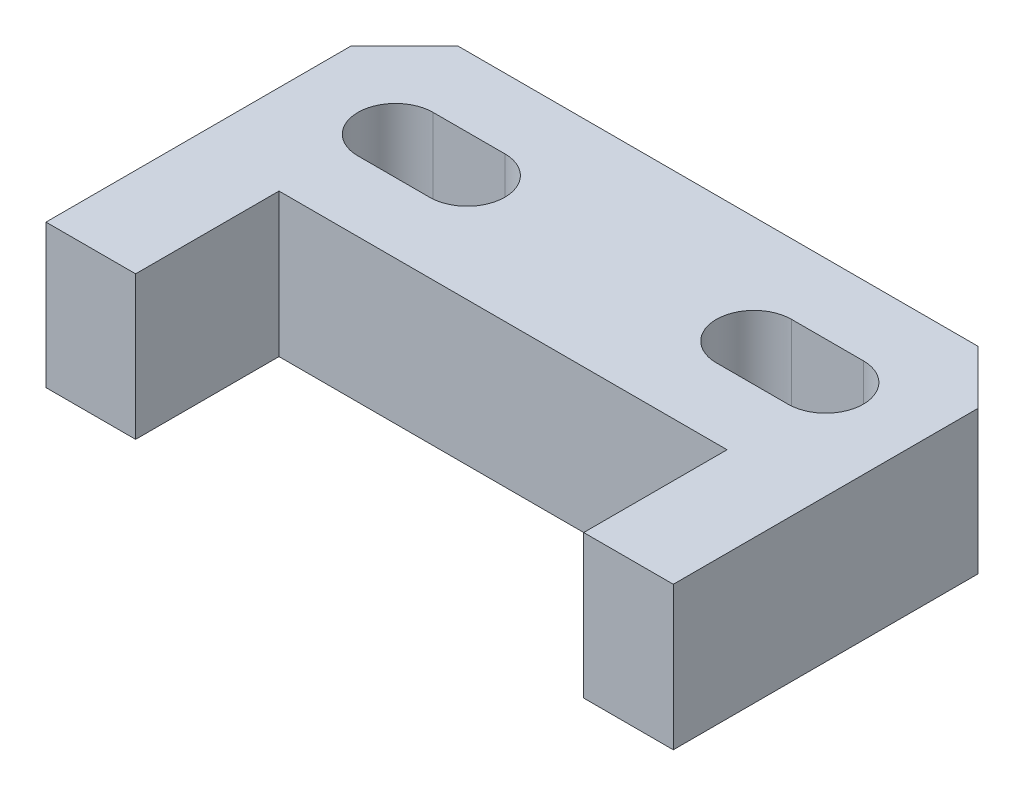
ISO-10303-21;
HEADER;
FILE_DESCRIPTION(('STEP AP214'),'2;1');
FILE_NAME('part.step','',(''),(''),'','','');
FILE_SCHEMA(('AUTOMOTIVE_DESIGN { 1 0 10303 214 1 1 1 1 }'));
ENDSEC;
DATA;
#1=APPLICATION_CONTEXT('core data for automotive mechanical design processes');
#2=APPLICATION_PROTOCOL_DEFINITION('international standard','automotive_design',2000,#1);
#3=PRODUCT_CONTEXT('',#1,'mechanical');
#4=PRODUCT('Part','Part','',(#3));
#5=PRODUCT_RELATED_PRODUCT_CATEGORY('part','',(#4));
#6=PRODUCT_DEFINITION_FORMATION('','',#4);
#7=PRODUCT_DEFINITION_CONTEXT('part definition',#1,'design');
#8=PRODUCT_DEFINITION('design','',#6,#7);
#9=PRODUCT_DEFINITION_SHAPE('','',#8);
#10=(LENGTH_UNIT() NAMED_UNIT(*) SI_UNIT(.MILLI.,.METRE.));
#11=(NAMED_UNIT(*) PLANE_ANGLE_UNIT() SI_UNIT($,.RADIAN.));
#12=(NAMED_UNIT(*) SI_UNIT($,.STERADIAN.) SOLID_ANGLE_UNIT());
#13=UNCERTAINTY_MEASURE_WITH_UNIT(LENGTH_MEASURE(1.E-05),#10,'distance_accuracy_value','');
#14=(GEOMETRIC_REPRESENTATION_CONTEXT(3) GLOBAL_UNCERTAINTY_ASSIGNED_CONTEXT((#13)) GLOBAL_UNIT_ASSIGNED_CONTEXT((#10,
#11,#12)) REPRESENTATION_CONTEXT('',''));
#15=CARTESIAN_POINT('',(0.,0.,0.));
#16=DIRECTION('',(0.,0.,1.));
#17=DIRECTION('',(1.,0.,0.));
#18=AXIS2_PLACEMENT_3D('',#15,#16,#17);
#19=CARTESIAN_POINT('',(5.,8.,0.));
#20=DIRECTION('',(0.,0.,-1.));
#21=DIRECTION('',(-1.,0.,0.));
#22=AXIS2_PLACEMENT_3D('',#19,#20,#21);
#23=PLANE('',#22);
#24=DIRECTION('',(1.,0.,0.));
#25=VECTOR('',#24,1.);
#26=CARTESIAN_POINT('',(5.,0.,0.));
#27=LINE('',#26,#25);
#28=CARTESIAN_POINT('',(0.,0.,0.));
#29=VERTEX_POINT('',#28);
#30=CARTESIAN_POINT('',(5.,0.,0.));
#31=VERTEX_POINT('',#30);
#32=EDGE_CURVE('E231',#29,#31,#27,.T.);
#33=ORIENTED_EDGE('',*,*,#32,.T.);
#34=DIRECTION('',(0.,-1.,0.));
#35=VECTOR('',#34,1.);
#36=CARTESIAN_POINT('',(5.,8.,0.));
#37=LINE('',#36,#35);
#38=CARTESIAN_POINT('',(5.,8.,0.));
#39=VERTEX_POINT('',#38);
#40=EDGE_CURVE('E287',#39,#31,#37,.T.);
#41=ORIENTED_EDGE('',*,*,#40,.F.);
#42=DIRECTION('',(1.,0.,0.));
#43=VECTOR('',#42,1.);
#44=CARTESIAN_POINT('',(5.,8.,0.));
#45=LINE('',#44,#43);
#46=CARTESIAN_POINT('',(0.,8.,0.));
#47=VERTEX_POINT('',#46);
#48=EDGE_CURVE('E238',#47,#39,#45,.T.);
#49=ORIENTED_EDGE('',*,*,#48,.F.);
#50=DIRECTION('',(0.,-1.,0.));
#51=VECTOR('',#50,1.);
#52=CARTESIAN_POINT('',(0.,8.,0.));
#53=LINE('',#52,#51);
#54=EDGE_CURVE('E256',#47,#29,#53,.T.);
#55=ORIENTED_EDGE('',*,*,#54,.T.);
#56=EDGE_LOOP('',(#33,#41,#49,#55));
#57=FACE_BOUND('',#56,.T.);
#58=ADVANCED_FACE('F34',(#57),#23,.F.);
#59=CARTESIAN_POINT('',(5.,8.,-8.));
#60=DIRECTION('',(-1.,0.,0.));
#61=DIRECTION('',(0.,0.,1.));
#62=AXIS2_PLACEMENT_3D('',#59,#60,#61);
#63=PLANE('',#62);
#64=DIRECTION('',(0.,0.,-1.));
#65=VECTOR('',#64,1.);
#66=CARTESIAN_POINT('',(5.,0.,-8.));
#67=LINE('',#66,#65);
#68=CARTESIAN_POINT('',(5.,0.,-8.));
#69=VERTEX_POINT('',#68);
#70=EDGE_CURVE('E259',#31,#69,#67,.T.);
#71=ORIENTED_EDGE('',*,*,#70,.T.);
#72=DIRECTION('',(0.,-1.,0.));
#73=VECTOR('',#72,1.);
#74=CARTESIAN_POINT('',(5.,8.,-8.));
#75=LINE('',#74,#73);
#76=CARTESIAN_POINT('',(5.,8.,-8.));
#77=VERTEX_POINT('',#76);
#78=EDGE_CURVE('E284',#77,#69,#75,.T.);
#79=ORIENTED_EDGE('',*,*,#78,.F.);
#80=DIRECTION('',(0.,0.,-1.));
#81=VECTOR('',#80,1.);
#82=CARTESIAN_POINT('',(5.,8.,-8.));
#83=LINE('',#82,#81);
#84=EDGE_CURVE('E241',#39,#77,#83,.T.);
#85=ORIENTED_EDGE('',*,*,#84,.F.);
#86=ORIENTED_EDGE('',*,*,#40,.T.);
#87=EDGE_LOOP('',(#71,#79,#85,#86));
#88=FACE_BOUND('',#87,.T.);
#89=ADVANCED_FACE('F330',(#88),#63,.F.);
#90=CARTESIAN_POINT('',(30.,8.,-8.00000000000001));
#91=DIRECTION('',(0.,0.,-1.));
#92=DIRECTION('',(-1.,0.,0.));
#93=AXIS2_PLACEMENT_3D('',#90,#91,#92);
#94=PLANE('',#93);
#95=DIRECTION('',(1.,0.,0.));
#96=VECTOR('',#95,1.);
#97=CARTESIAN_POINT('',(30.,0.,-8.00000000000001));
#98=LINE('',#97,#96);
#99=CARTESIAN_POINT('',(30.,0.,-8.00000000000001));
#100=VERTEX_POINT('',#99);
#101=EDGE_CURVE('E261',#69,#100,#98,.T.);
#102=ORIENTED_EDGE('',*,*,#101,.T.);
#103=DIRECTION('',(0.,-1.,0.));
#104=VECTOR('',#103,1.);
#105=CARTESIAN_POINT('',(30.,8.,-8.00000000000001));
#106=LINE('',#105,#104);
#107=CARTESIAN_POINT('',(30.,8.,-8.00000000000001));
#108=VERTEX_POINT('',#107);
#109=EDGE_CURVE('E281',#108,#100,#106,.T.);
#110=ORIENTED_EDGE('',*,*,#109,.F.);
#111=DIRECTION('',(1.,0.,0.));
#112=VECTOR('',#111,1.);
#113=CARTESIAN_POINT('',(30.,8.,-8.00000000000001));
#114=LINE('',#113,#112);
#115=EDGE_CURVE('E244',#77,#108,#114,.T.);
#116=ORIENTED_EDGE('',*,*,#115,.F.);
#117=ORIENTED_EDGE('',*,*,#78,.T.);
#118=EDGE_LOOP('',(#102,#110,#116,#117));
#119=FACE_BOUND('',#118,.T.);
#120=ADVANCED_FACE('F327',(#119),#94,.F.);
#121=CARTESIAN_POINT('',(30.,8.,0.));
#122=DIRECTION('',(1.,0.,0.));
#123=DIRECTION('',(0.,0.,-1.));
#124=AXIS2_PLACEMENT_3D('',#121,#122,#123);
#125=PLANE('',#124);
#126=DIRECTION('',(0.,0.,1.));
#127=VECTOR('',#126,1.);
#128=CARTESIAN_POINT('',(30.,0.,0.));
#129=LINE('',#128,#127);
#130=CARTESIAN_POINT('',(30.,0.,0.));
#131=VERTEX_POINT('',#130);
#132=EDGE_CURVE('E263',#100,#131,#129,.T.);
#133=ORIENTED_EDGE('',*,*,#132,.T.);
#134=DIRECTION('',(0.,-1.,0.));
#135=VECTOR('',#134,1.);
#136=CARTESIAN_POINT('',(30.,8.,0.));
#137=LINE('',#136,#135);
#138=CARTESIAN_POINT('',(30.,8.,0.));
#139=VERTEX_POINT('',#138);
#140=EDGE_CURVE('E278',#139,#131,#137,.T.);
#141=ORIENTED_EDGE('',*,*,#140,.F.);
#142=DIRECTION('',(0.,0.,1.));
#143=VECTOR('',#142,1.);
#144=CARTESIAN_POINT('',(30.,8.,0.));
#145=LINE('',#144,#143);
#146=EDGE_CURVE('E246',#108,#139,#145,.T.);
#147=ORIENTED_EDGE('',*,*,#146,.F.);
#148=ORIENTED_EDGE('',*,*,#109,.T.);
#149=EDGE_LOOP('',(#133,#141,#147,#148));
#150=FACE_BOUND('',#149,.T.);
#151=ADVANCED_FACE('F322',(#150),#125,.F.);
#152=CARTESIAN_POINT('',(35.,8.,0.));
#153=DIRECTION('',(0.,0.,-1.));
#154=DIRECTION('',(-1.,0.,0.));
#155=AXIS2_PLACEMENT_3D('',#152,#153,#154);
#156=PLANE('',#155);
#157=DIRECTION('',(1.,0.,0.));
#158=VECTOR('',#157,1.);
#159=CARTESIAN_POINT('',(35.,0.,0.));
#160=LINE('',#159,#158);
#161=CARTESIAN_POINT('',(35.,0.,0.));
#162=VERTEX_POINT('',#161);
#163=EDGE_CURVE('E265',#131,#162,#160,.T.);
#164=ORIENTED_EDGE('',*,*,#163,.T.);
#165=DIRECTION('',(0.,-1.,0.));
#166=VECTOR('',#165,1.);
#167=CARTESIAN_POINT('',(35.,8.,0.));
#168=LINE('',#167,#166);
#169=CARTESIAN_POINT('',(35.,8.,0.));
#170=VERTEX_POINT('',#169);
#171=EDGE_CURVE('E275',#170,#162,#168,.T.);
#172=ORIENTED_EDGE('',*,*,#171,.F.);
#173=DIRECTION('',(1.,0.,0.));
#174=VECTOR('',#173,1.);
#175=CARTESIAN_POINT('',(35.,8.,0.));
#176=LINE('',#175,#174);
#177=EDGE_CURVE('E248',#139,#170,#176,.T.);
#178=ORIENTED_EDGE('',*,*,#177,.F.);
#179=ORIENTED_EDGE('',*,*,#140,.T.);
#180=EDGE_LOOP('',(#164,#172,#178,#179));
#181=FACE_BOUND('',#180,.T.);
#182=ADVANCED_FACE('F317',(#181),#156,.F.);
#183=CARTESIAN_POINT('',(35.,8.,-20.));
#184=DIRECTION('',(-1.,0.,0.));
#185=DIRECTION('',(0.,0.,1.));
#186=AXIS2_PLACEMENT_3D('',#183,#184,#185);
#187=PLANE('',#186);
#188=DIRECTION('',(0.,0.,-1.));
#189=VECTOR('',#188,1.);
#190=CARTESIAN_POINT('',(35.,0.,-20.));
#191=LINE('',#190,#189);
#192=CARTESIAN_POINT('',(35.,0.,-17.));
#193=VERTEX_POINT('',#192);
#194=EDGE_CURVE('E267',#162,#193,#191,.T.);
#195=ORIENTED_EDGE('',*,*,#194,.T.);
#196=DIRECTION('',(0.,1.,0.));
#197=VECTOR('',#196,1.);
#198=CARTESIAN_POINT('',(35.,8.,-17.));
#199=LINE('',#198,#197);
#200=CARTESIAN_POINT('',(35.,8.,-17.));
#201=VERTEX_POINT('',#200);
#202=EDGE_CURVE('E57',#193,#201,#199,.T.);
#203=ORIENTED_EDGE('',*,*,#202,.T.);
#204=DIRECTION('',(0.,0.,-1.));
#205=VECTOR('',#204,1.);
#206=CARTESIAN_POINT('',(35.,8.,-20.));
#207=LINE('',#206,#205);
#208=EDGE_CURVE('E250',#170,#201,#207,.T.);
#209=ORIENTED_EDGE('',*,*,#208,.F.);
#210=ORIENTED_EDGE('',*,*,#171,.T.);
#211=EDGE_LOOP('',(#195,#203,#209,#210));
#212=FACE_BOUND('',#211,.T.);
#213=ADVANCED_FACE('F313',(#212),#187,.F.);
#214=CARTESIAN_POINT('',(0.,8.,-20.));
#215=DIRECTION('',(0.,0.,1.));
#216=DIRECTION('',(1.,0.,0.));
#217=AXIS2_PLACEMENT_3D('',#214,#215,#216);
#218=PLANE('',#217);
#219=DIRECTION('',(-1.,0.,0.));
#220=VECTOR('',#219,1.);
#221=CARTESIAN_POINT('',(0.,8.,-20.));
#222=LINE('',#221,#220);
#223=CARTESIAN_POINT('',(32.,8.,-20.));
#224=VERTEX_POINT('',#223);
#225=CARTESIAN_POINT('',(3.00000000000001,8.,-20.));
#226=VERTEX_POINT('',#225);
#227=EDGE_CURVE('E252',#224,#226,#222,.T.);
#228=ORIENTED_EDGE('',*,*,#227,.F.);
#229=DIRECTION('',(0.,-1.,0.));
#230=VECTOR('',#229,1.);
#231=CARTESIAN_POINT('',(32.,8.,-20.));
#232=LINE('',#231,#230);
#233=CARTESIAN_POINT('',(32.,0.,-20.));
#234=VERTEX_POINT('',#233);
#235=EDGE_CURVE('E292',#224,#234,#232,.T.);
#236=ORIENTED_EDGE('',*,*,#235,.T.);
#237=DIRECTION('',(-1.,0.,0.));
#238=VECTOR('',#237,1.);
#239=CARTESIAN_POINT('',(0.,0.,-20.));
#240=LINE('',#239,#238);
#241=CARTESIAN_POINT('',(3.00000000000001,0.,-20.));
#242=VERTEX_POINT('',#241);
#243=EDGE_CURVE('E269',#234,#242,#240,.T.);
#244=ORIENTED_EDGE('',*,*,#243,.T.);
#245=DIRECTION('',(0.,1.,0.));
#246=VECTOR('',#245,1.);
#247=CARTESIAN_POINT('',(3.00000000000001,8.,-20.));
#248=LINE('',#247,#246);
#249=EDGE_CURVE('E290',#242,#226,#248,.T.);
#250=ORIENTED_EDGE('',*,*,#249,.T.);
#251=EDGE_LOOP('',(#228,#236,#244,#250));
#252=FACE_BOUND('',#251,.T.);
#253=ADVANCED_FACE('F306',(#252),#218,.F.);
#254=CARTESIAN_POINT('',(0.,8.,0.));
#255=DIRECTION('',(1.,0.,0.));
#256=DIRECTION('',(0.,0.,-1.));
#257=AXIS2_PLACEMENT_3D('',#254,#255,#256);
#258=PLANE('',#257);
#259=DIRECTION('',(0.,0.,1.));
#260=VECTOR('',#259,1.);
#261=CARTESIAN_POINT('',(0.,8.,0.));
#262=LINE('',#261,#260);
#263=CARTESIAN_POINT('',(0.,8.,-17.));
#264=VERTEX_POINT('',#263);
#265=EDGE_CURVE('E254',#264,#47,#262,.T.);
#266=ORIENTED_EDGE('',*,*,#265,.F.);
#267=DIRECTION('',(0.,-1.,0.));
#268=VECTOR('',#267,1.);
#269=CARTESIAN_POINT('',(0.,8.,-17.));
#270=LINE('',#269,#268);
#271=CARTESIAN_POINT('',(0.,0.,-17.));
#272=VERTEX_POINT('',#271);
#273=EDGE_CURVE('E11',#264,#272,#270,.T.);
#274=ORIENTED_EDGE('',*,*,#273,.T.);
#275=DIRECTION('',(0.,0.,1.));
#276=VECTOR('',#275,1.);
#277=CARTESIAN_POINT('',(0.,0.,0.));
#278=LINE('',#277,#276);
#279=EDGE_CURVE('E242',#272,#29,#278,.T.);
#280=ORIENTED_EDGE('',*,*,#279,.T.);
#281=ORIENTED_EDGE('',*,*,#54,.F.);
#282=EDGE_LOOP('',(#266,#274,#280,#281));
#283=FACE_BOUND('',#282,.T.);
#284=ADVANCED_FACE('F338',(#283),#258,.F.);
#285=CARTESIAN_POINT('',(0.,8.,0.));
#286=DIRECTION('',(0.,-1.,0.));
#287=DIRECTION('',(0.,0.,-1.));
#288=AXIS2_PLACEMENT_3D('',#285,#286,#287);
#289=PLANE('',#288);
#290=DIRECTION('',(1.,0.,0.));
#291=VECTOR('',#290,1.);
#292=CARTESIAN_POINT('',(5.5,8.,-11.9));
#293=LINE('',#292,#291);
#294=CARTESIAN_POINT('',(5.5,8.,-11.9));
#295=VERTEX_POINT('',#294);
#296=CARTESIAN_POINT('',(9.5,8.,-11.9));
#297=VERTEX_POINT('',#296);
#298=EDGE_CURVE('E196',#295,#297,#293,.T.);
#299=ORIENTED_EDGE('',*,*,#298,.F.);
#300=CARTESIAN_POINT('',(5.5,8.,-14.));
#301=DIRECTION('',(0.,1.,0.));
#302=DIRECTION('',(0.,0.,1.));
#303=AXIS2_PLACEMENT_3D('',#300,#301,#302);
#304=CIRCLE('',#303,2.1);
#305=CARTESIAN_POINT('',(5.5,8.,-16.1));
#306=VERTEX_POINT('',#305);
#307=EDGE_CURVE('E169',#306,#295,#304,.T.);
#308=ORIENTED_EDGE('',*,*,#307,.F.);
#309=DIRECTION('',(-1.,0.,0.));
#310=VECTOR('',#309,1.);
#311=CARTESIAN_POINT('',(5.5,8.,-16.1));
#312=LINE('',#311,#310);
#313=CARTESIAN_POINT('',(9.5,8.,-16.1));
#314=VERTEX_POINT('',#313);
#315=EDGE_CURVE('E187',#314,#306,#312,.T.);
#316=ORIENTED_EDGE('',*,*,#315,.F.);
#317=CARTESIAN_POINT('',(9.5,8.,-14.));
#318=DIRECTION('',(0.,1.,0.));
#319=DIRECTION('',(0.,0.,1.));
#320=AXIS2_PLACEMENT_3D('',#317,#318,#319);
#321=CIRCLE('',#320,2.1);
#322=EDGE_CURVE('E190',#297,#314,#321,.T.);
#323=ORIENTED_EDGE('',*,*,#322,.F.);
#324=EDGE_LOOP('',(#299,#308,#316,#323));
#325=FACE_BOUND('',#324,.T.);
#326=DIRECTION('',(-1.,0.,0.));
#327=VECTOR('',#326,1.);
#328=CARTESIAN_POINT('',(29.5,8.,-16.1));
#329=LINE('',#328,#327);
#330=CARTESIAN_POINT('',(29.5,8.,-16.1));
#331=VERTEX_POINT('',#330);
#332=CARTESIAN_POINT('',(25.5,8.,-16.1));
#333=VERTEX_POINT('',#332);
#334=EDGE_CURVE('E221',#331,#333,#329,.T.);
#335=ORIENTED_EDGE('',*,*,#334,.F.);
#336=CARTESIAN_POINT('',(29.5,8.,-14.));
#337=DIRECTION('',(0.,1.,0.));
#338=DIRECTION('',(0.,0.,1.));
#339=AXIS2_PLACEMENT_3D('',#336,#337,#338);
#340=CIRCLE('',#339,2.1);
#341=CARTESIAN_POINT('',(29.5,8.,-11.9));
#342=VERTEX_POINT('',#341);
#343=EDGE_CURVE('E202',#342,#331,#340,.T.);
#344=ORIENTED_EDGE('',*,*,#343,.F.);
#345=DIRECTION('',(1.,0.,0.));
#346=VECTOR('',#345,1.);
#347=CARTESIAN_POINT('',(29.5,8.,-11.9));
#348=LINE('',#347,#346);
#349=CARTESIAN_POINT('',(25.5,8.,-11.9));
#350=VERTEX_POINT('',#349);
#351=EDGE_CURVE('E210',#350,#342,#348,.T.);
#352=ORIENTED_EDGE('',*,*,#351,.F.);
#353=CARTESIAN_POINT('',(25.5,8.,-14.));
#354=DIRECTION('',(0.,1.,0.));
#355=DIRECTION('',(0.,0.,1.));
#356=AXIS2_PLACEMENT_3D('',#353,#354,#355);
#357=CIRCLE('',#356,2.1);
#358=EDGE_CURVE('E224',#333,#350,#357,.T.);
#359=ORIENTED_EDGE('',*,*,#358,.F.);
#360=EDGE_LOOP('',(#335,#344,#352,#359));
#361=FACE_BOUND('',#360,.T.);
#362=ORIENTED_EDGE('',*,*,#208,.T.);
#363=DIRECTION('',(0.707106781186545,0.,0.70710678118655));
#364=VECTOR('',#363,1.);
#365=CARTESIAN_POINT('',(32.,8.,-20.));
#366=LINE('',#365,#364);
#367=EDGE_CURVE('E42',#201,#224,#366,.F.);
#368=ORIENTED_EDGE('',*,*,#367,.T.);
#369=ORIENTED_EDGE('',*,*,#227,.T.);
#370=DIRECTION('',(0.707106781186549,0.,-0.707106781186546));
#371=VECTOR('',#370,1.);
#372=CARTESIAN_POINT('',(0.,8.,-17.));
#373=LINE('',#372,#371);
#374=EDGE_CURVE('E49',#226,#264,#373,.F.);
#375=ORIENTED_EDGE('',*,*,#374,.T.);
#376=ORIENTED_EDGE('',*,*,#265,.T.);
#377=ORIENTED_EDGE('',*,*,#48,.T.);
#378=ORIENTED_EDGE('',*,*,#84,.T.);
#379=ORIENTED_EDGE('',*,*,#115,.T.);
#380=ORIENTED_EDGE('',*,*,#146,.T.);
#381=ORIENTED_EDGE('',*,*,#177,.T.);
#382=EDGE_LOOP('',(#362,#368,#369,#375,#376,#377,#378,#379,#380,#381));
#383=FACE_BOUND('',#382,.T.);
#384=ADVANCED_FACE('F302',(#325,#361,#383),#289,.F.);
#385=CARTESIAN_POINT('',(0.,0.,0.));
#386=DIRECTION('',(0.,-1.,0.));
#387=DIRECTION('',(0.,0.,-1.));
#388=AXIS2_PLACEMENT_3D('',#385,#386,#387);
#389=PLANE('',#388);
#390=CARTESIAN_POINT('',(5.5,0.,-14.));
#391=DIRECTION('',(0.,1.,0.));
#392=DIRECTION('',(0.,0.,1.));
#393=AXIS2_PLACEMENT_3D('',#390,#391,#392);
#394=CIRCLE('',#393,2.1);
#395=CARTESIAN_POINT('',(5.5,0.,-16.1));
#396=VERTEX_POINT('',#395);
#397=CARTESIAN_POINT('',(5.5,0.,-11.9));
#398=VERTEX_POINT('',#397);
#399=EDGE_CURVE('E166',#396,#398,#394,.T.);
#400=ORIENTED_EDGE('',*,*,#399,.T.);
#401=DIRECTION('',(1.,0.,0.));
#402=VECTOR('',#401,1.);
#403=CARTESIAN_POINT('',(5.5,0.,-11.9));
#404=LINE('',#403,#402);
#405=CARTESIAN_POINT('',(9.5,0.,-11.9));
#406=VERTEX_POINT('',#405);
#407=EDGE_CURVE('E178',#398,#406,#404,.T.);
#408=ORIENTED_EDGE('',*,*,#407,.T.);
#409=CARTESIAN_POINT('',(9.5,0.,-14.));
#410=DIRECTION('',(0.,1.,0.));
#411=DIRECTION('',(0.,0.,1.));
#412=AXIS2_PLACEMENT_3D('',#409,#410,#411);
#413=CIRCLE('',#412,2.1);
#414=CARTESIAN_POINT('',(9.5,0.,-16.1));
#415=VERTEX_POINT('',#414);
#416=EDGE_CURVE('E182',#406,#415,#413,.T.);
#417=ORIENTED_EDGE('',*,*,#416,.T.);
#418=DIRECTION('',(-1.,0.,0.));
#419=VECTOR('',#418,1.);
#420=CARTESIAN_POINT('',(5.5,0.,-16.1));
#421=LINE('',#420,#419);
#422=EDGE_CURVE('E174',#415,#396,#421,.T.);
#423=ORIENTED_EDGE('',*,*,#422,.T.);
#424=EDGE_LOOP('',(#400,#408,#417,#423));
#425=FACE_BOUND('',#424,.T.);
#426=CARTESIAN_POINT('',(29.5,0.,-14.));
#427=DIRECTION('',(0.,1.,0.));
#428=DIRECTION('',(0.,0.,1.));
#429=AXIS2_PLACEMENT_3D('',#426,#427,#428);
#430=CIRCLE('',#429,2.1);
#431=CARTESIAN_POINT('',(29.5,0.,-11.9));
#432=VERTEX_POINT('',#431);
#433=CARTESIAN_POINT('',(29.5,0.,-16.1));
#434=VERTEX_POINT('',#433);
#435=EDGE_CURVE('E206',#432,#434,#430,.T.);
#436=ORIENTED_EDGE('',*,*,#435,.T.);
#437=DIRECTION('',(-1.,0.,0.));
#438=VECTOR('',#437,1.);
#439=CARTESIAN_POINT('',(29.5,0.,-16.1));
#440=LINE('',#439,#438);
#441=CARTESIAN_POINT('',(25.5,0.,-16.1));
#442=VERTEX_POINT('',#441);
#443=EDGE_CURVE('E209',#434,#442,#440,.T.);
#444=ORIENTED_EDGE('',*,*,#443,.T.);
#445=CARTESIAN_POINT('',(25.5,0.,-14.));
#446=DIRECTION('',(0.,1.,0.));
#447=DIRECTION('',(0.,0.,1.));
#448=AXIS2_PLACEMENT_3D('',#445,#446,#447);
#449=CIRCLE('',#448,2.1);
#450=CARTESIAN_POINT('',(25.5,0.,-11.9));
#451=VERTEX_POINT('',#450);
#452=EDGE_CURVE('E213',#442,#451,#449,.T.);
#453=ORIENTED_EDGE('',*,*,#452,.T.);
#454=DIRECTION('',(1.,0.,0.));
#455=VECTOR('',#454,1.);
#456=CARTESIAN_POINT('',(29.5,0.,-11.9));
#457=LINE('',#456,#455);
#458=EDGE_CURVE('E216',#451,#432,#457,.T.);
#459=ORIENTED_EDGE('',*,*,#458,.T.);
#460=EDGE_LOOP('',(#436,#444,#453,#459));
#461=FACE_BOUND('',#460,.T.);
#462=ORIENTED_EDGE('',*,*,#243,.F.);
#463=DIRECTION('',(-0.707106781186545,0.,-0.70710678118655));
#464=VECTOR('',#463,1.);
#465=CARTESIAN_POINT('',(26.0000000000001,0.,-26.));
#466=LINE('',#465,#464);
#467=EDGE_CURVE('E297',#234,#193,#466,.F.);
#468=ORIENTED_EDGE('',*,*,#467,.T.);
#469=ORIENTED_EDGE('',*,*,#194,.F.);
#470=ORIENTED_EDGE('',*,*,#163,.F.);
#471=ORIENTED_EDGE('',*,*,#132,.F.);
#472=ORIENTED_EDGE('',*,*,#101,.F.);
#473=ORIENTED_EDGE('',*,*,#70,.F.);
#474=ORIENTED_EDGE('',*,*,#32,.F.);
#475=ORIENTED_EDGE('',*,*,#279,.F.);
#476=DIRECTION('',(-0.707106781186549,0.,0.707106781186546));
#477=VECTOR('',#476,1.);
#478=CARTESIAN_POINT('',(-8.5,0.,-8.50000000000003));
#479=LINE('',#478,#477);
#480=EDGE_CURVE('E295',#272,#242,#479,.F.);
#481=ORIENTED_EDGE('',*,*,#480,.T.);
#482=EDGE_LOOP('',(#462,#468,#469,#470,#471,#472,#473,#474,#475,#481));
#483=FACE_BOUND('',#482,.T.);
#484=ADVANCED_FACE('F184',(#425,#461,#483),#389,.T.);
#485=CARTESIAN_POINT('',(29.5,0.,-14.));
#486=DIRECTION('',(0.,1.,0.));
#487=DIRECTION('',(0.,0.,1.));
#488=AXIS2_PLACEMENT_3D('',#485,#486,#487);
#489=CYLINDRICAL_SURFACE('',#488,2.1);
#490=ORIENTED_EDGE('',*,*,#343,.T.);
#491=DIRECTION('',(0.,1.,0.));
#492=VECTOR('',#491,1.);
#493=CARTESIAN_POINT('',(29.5,0.,-16.1));
#494=LINE('',#493,#492);
#495=EDGE_CURVE('E219',#434,#331,#494,.T.);
#496=ORIENTED_EDGE('',*,*,#495,.F.);
#497=ORIENTED_EDGE('',*,*,#435,.F.);
#498=DIRECTION('',(0.,1.,0.));
#499=VECTOR('',#498,1.);
#500=CARTESIAN_POINT('',(29.5,0.,-11.9));
#501=LINE('',#500,#499);
#502=EDGE_CURVE('E229',#432,#342,#501,.T.);
#503=ORIENTED_EDGE('',*,*,#502,.T.);
#504=EDGE_LOOP('',(#490,#496,#497,#503));
#505=FACE_BOUND('',#504,.T.);
#506=ADVANCED_FACE('F366',(#505),#489,.F.);
#507=CARTESIAN_POINT('',(29.5,0.,-11.9));
#508=DIRECTION('',(0.,0.,1.));
#509=DIRECTION('',(1.,0.,0.));
#510=AXIS2_PLACEMENT_3D('',#507,#508,#509);
#511=PLANE('',#510);
#512=ORIENTED_EDGE('',*,*,#351,.T.);
#513=ORIENTED_EDGE('',*,*,#502,.F.);
#514=ORIENTED_EDGE('',*,*,#458,.F.);
#515=DIRECTION('',(0.,1.,0.));
#516=VECTOR('',#515,1.);
#517=CARTESIAN_POINT('',(25.5,0.,-11.9));
#518=LINE('',#517,#516);
#519=EDGE_CURVE('E232',#451,#350,#518,.T.);
#520=ORIENTED_EDGE('',*,*,#519,.T.);
#521=EDGE_LOOP('',(#512,#513,#514,#520));
#522=FACE_BOUND('',#521,.T.);
#523=ADVANCED_FACE('F372',(#522),#511,.F.);
#524=CARTESIAN_POINT('',(25.5,0.,-14.));
#525=DIRECTION('',(0.,1.,0.));
#526=DIRECTION('',(0.,0.,1.));
#527=AXIS2_PLACEMENT_3D('',#524,#525,#526);
#528=CYLINDRICAL_SURFACE('',#527,2.1);
#529=ORIENTED_EDGE('',*,*,#358,.T.);
#530=ORIENTED_EDGE('',*,*,#519,.F.);
#531=ORIENTED_EDGE('',*,*,#452,.F.);
#532=DIRECTION('',(0.,1.,0.));
#533=VECTOR('',#532,1.);
#534=CARTESIAN_POINT('',(25.5,0.,-16.1));
#535=LINE('',#534,#533);
#536=EDGE_CURVE('E234',#442,#333,#535,.T.);
#537=ORIENTED_EDGE('',*,*,#536,.T.);
#538=EDGE_LOOP('',(#529,#530,#531,#537));
#539=FACE_BOUND('',#538,.T.);
#540=ADVANCED_FACE('F377',(#539),#528,.F.);
#541=CARTESIAN_POINT('',(29.5,0.,-16.1));
#542=DIRECTION('',(0.,0.,-1.));
#543=DIRECTION('',(-1.,0.,0.));
#544=AXIS2_PLACEMENT_3D('',#541,#542,#543);
#545=PLANE('',#544);
#546=ORIENTED_EDGE('',*,*,#334,.T.);
#547=ORIENTED_EDGE('',*,*,#536,.F.);
#548=ORIENTED_EDGE('',*,*,#443,.F.);
#549=ORIENTED_EDGE('',*,*,#495,.T.);
#550=EDGE_LOOP('',(#546,#547,#548,#549));
#551=FACE_BOUND('',#550,.T.);
#552=ADVANCED_FACE('F374',(#551),#545,.F.);
#553=CARTESIAN_POINT('',(5.5,0.,-14.));
#554=DIRECTION('',(0.,1.,0.));
#555=DIRECTION('',(0.,0.,1.));
#556=AXIS2_PLACEMENT_3D('',#553,#554,#555);
#557=CYLINDRICAL_SURFACE('',#556,2.1);
#558=ORIENTED_EDGE('',*,*,#307,.T.);
#559=DIRECTION('',(0.,1.,0.));
#560=VECTOR('',#559,1.);
#561=CARTESIAN_POINT('',(5.5,0.,-11.9));
#562=LINE('',#561,#560);
#563=EDGE_CURVE('E162',#398,#295,#562,.T.);
#564=ORIENTED_EDGE('',*,*,#563,.F.);
#565=ORIENTED_EDGE('',*,*,#399,.F.);
#566=DIRECTION('',(0.,1.,0.));
#567=VECTOR('',#566,1.);
#568=CARTESIAN_POINT('',(5.5,0.,-16.1));
#569=LINE('',#568,#567);
#570=EDGE_CURVE('E200',#396,#306,#569,.T.);
#571=ORIENTED_EDGE('',*,*,#570,.T.);
#572=EDGE_LOOP('',(#558,#564,#565,#571));
#573=FACE_BOUND('',#572,.T.);
#574=ADVANCED_FACE('F164',(#573),#557,.F.);
#575=CARTESIAN_POINT('',(5.5,0.,-16.1));
#576=DIRECTION('',(0.,0.,-1.));
#577=DIRECTION('',(-1.,0.,0.));
#578=AXIS2_PLACEMENT_3D('',#575,#576,#577);
#579=PLANE('',#578);
#580=ORIENTED_EDGE('',*,*,#315,.T.);
#581=ORIENTED_EDGE('',*,*,#570,.F.);
#582=ORIENTED_EDGE('',*,*,#422,.F.);
#583=DIRECTION('',(0.,1.,0.));
#584=VECTOR('',#583,1.);
#585=CARTESIAN_POINT('',(9.5,0.,-16.1));
#586=LINE('',#585,#584);
#587=EDGE_CURVE('E203',#415,#314,#586,.T.);
#588=ORIENTED_EDGE('',*,*,#587,.T.);
#589=EDGE_LOOP('',(#580,#581,#582,#588));
#590=FACE_BOUND('',#589,.T.);
#591=ADVANCED_FACE('F387',(#590),#579,.F.);
#592=CARTESIAN_POINT('',(9.5,0.,-14.));
#593=DIRECTION('',(0.,1.,0.));
#594=DIRECTION('',(0.,0.,1.));
#595=AXIS2_PLACEMENT_3D('',#592,#593,#594);
#596=CYLINDRICAL_SURFACE('',#595,2.1);
#597=ORIENTED_EDGE('',*,*,#322,.T.);
#598=ORIENTED_EDGE('',*,*,#587,.F.);
#599=ORIENTED_EDGE('',*,*,#416,.F.);
#600=DIRECTION('',(0.,1.,0.));
#601=VECTOR('',#600,1.);
#602=CARTESIAN_POINT('',(9.5,0.,-11.9));
#603=LINE('',#602,#601);
#604=EDGE_CURVE('E173',#406,#297,#603,.T.);
#605=ORIENTED_EDGE('',*,*,#604,.T.);
#606=EDGE_LOOP('',(#597,#598,#599,#605));
#607=FACE_BOUND('',#606,.T.);
#608=ADVANCED_FACE('F390',(#607),#596,.F.);
#609=CARTESIAN_POINT('',(5.5,0.,-11.9));
#610=DIRECTION('',(0.,0.,1.));
#611=DIRECTION('',(1.,0.,0.));
#612=AXIS2_PLACEMENT_3D('',#609,#610,#611);
#613=PLANE('',#612);
#614=ORIENTED_EDGE('',*,*,#298,.T.);
#615=ORIENTED_EDGE('',*,*,#604,.F.);
#616=ORIENTED_EDGE('',*,*,#407,.F.);
#617=ORIENTED_EDGE('',*,*,#563,.T.);
#618=EDGE_LOOP('',(#614,#615,#616,#617));
#619=FACE_BOUND('',#618,.T.);
#620=ADVANCED_FACE('F179',(#619),#613,.F.);
#621=CARTESIAN_POINT('',(32.,8.,-20.));
#622=DIRECTION('',(-0.70710678118655,0.,0.707106781186545));
#623=DIRECTION('',(0.,-1.,0.));
#624=AXIS2_PLACEMENT_3D('',#621,#622,#623);
#625=PLANE('',#624);
#626=ORIENTED_EDGE('',*,*,#367,.F.);
#627=ORIENTED_EDGE('',*,*,#202,.F.);
#628=ORIENTED_EDGE('',*,*,#467,.F.);
#629=ORIENTED_EDGE('',*,*,#235,.F.);
#630=EDGE_LOOP('',(#626,#627,#628,#629));
#631=FACE_BOUND('',#630,.T.);
#632=ADVANCED_FACE('F309',(#631),#625,.F.);
#633=CARTESIAN_POINT('',(0.,8.,-17.));
#634=DIRECTION('',(0.707106781186546,0.,0.707106781186549));
#635=DIRECTION('',(0.,-1.,0.));
#636=AXIS2_PLACEMENT_3D('',#633,#634,#635);
#637=PLANE('',#636);
#638=ORIENTED_EDGE('',*,*,#374,.F.);
#639=ORIENTED_EDGE('',*,*,#249,.F.);
#640=ORIENTED_EDGE('',*,*,#480,.F.);
#641=ORIENTED_EDGE('',*,*,#273,.F.);
#642=EDGE_LOOP('',(#638,#639,#640,#641));
#643=FACE_BOUND('',#642,.T.);
#644=ADVANCED_FACE('F36',(#643),#637,.F.);
#645=CLOSED_SHELL('',(#58,#89,#120,#151,#182,#213,#253,#284,#384,#484,#506,#523,#540,#552,#574,
#591,#608,#620,#632,#644));
#646=MANIFOLD_SOLID_BREP('B2',#645);
#647=ADVANCED_BREP_SHAPE_REPRESENTATION('',(#18,#646),#14);
#648=SHAPE_DEFINITION_REPRESENTATION(#9,#647);
ENDSEC;
END-ISO-10303-21;
